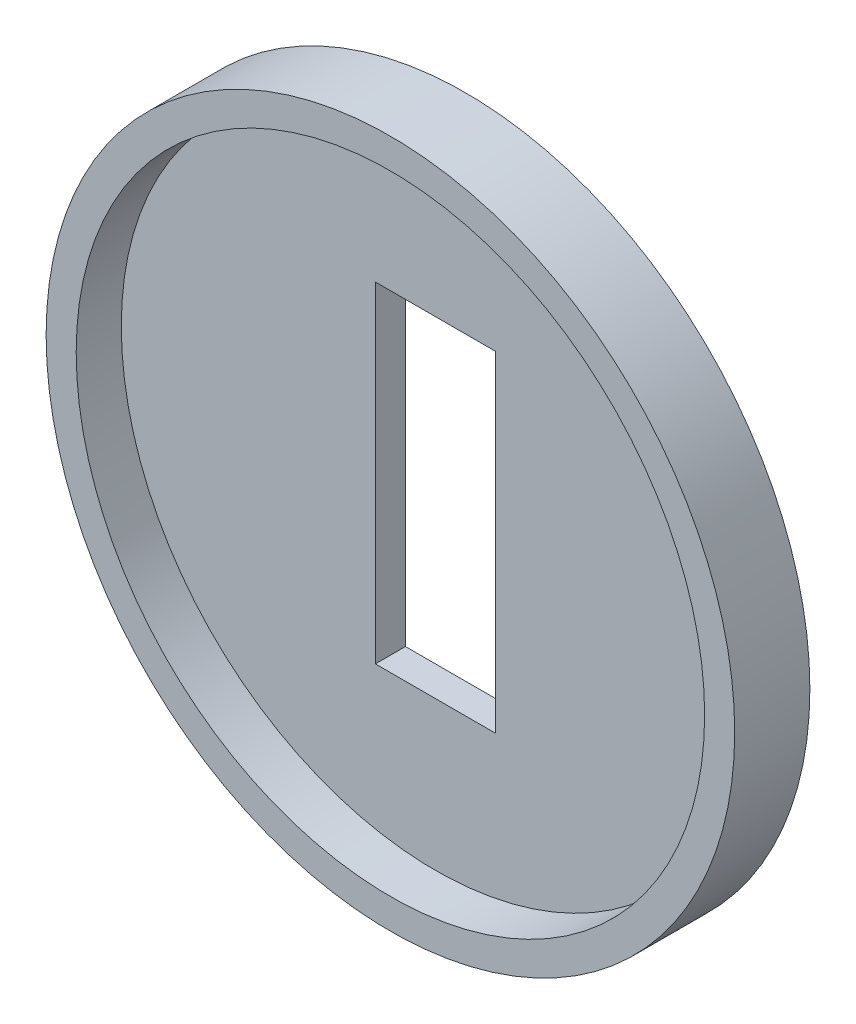
ISO-10303-21;
HEADER;
FILE_DESCRIPTION(('STEP AP214'),'2;1');
FILE_NAME('part.step','',(''),(''),'','','');
FILE_SCHEMA(('AUTOMOTIVE_DESIGN { 1 0 10303 214 1 1 1 1 }'));
ENDSEC;
DATA;
#1=APPLICATION_CONTEXT('core data for automotive mechanical design processes');
#2=APPLICATION_PROTOCOL_DEFINITION('international standard','automotive_design',2000,#1);
#3=PRODUCT_CONTEXT('',#1,'mechanical');
#4=PRODUCT('Part','Part','',(#3));
#5=PRODUCT_RELATED_PRODUCT_CATEGORY('part','',(#4));
#6=PRODUCT_DEFINITION_FORMATION('','',#4);
#7=PRODUCT_DEFINITION_CONTEXT('part definition',#1,'design');
#8=PRODUCT_DEFINITION('design','',#6,#7);
#9=PRODUCT_DEFINITION_SHAPE('','',#8);
#10=(LENGTH_UNIT() NAMED_UNIT(*) SI_UNIT(.MILLI.,.METRE.));
#11=(NAMED_UNIT(*) PLANE_ANGLE_UNIT() SI_UNIT($,.RADIAN.));
#12=(NAMED_UNIT(*) SI_UNIT($,.STERADIAN.) SOLID_ANGLE_UNIT());
#13=UNCERTAINTY_MEASURE_WITH_UNIT(LENGTH_MEASURE(1.E-05),#10,'distance_accuracy_value','');
#14=(GEOMETRIC_REPRESENTATION_CONTEXT(3) GLOBAL_UNCERTAINTY_ASSIGNED_CONTEXT((#13)) GLOBAL_UNIT_ASSIGNED_CONTEXT((#10,
#11,#12)) REPRESENTATION_CONTEXT('',''));
#15=CARTESIAN_POINT('',(0.,0.,0.));
#16=DIRECTION('',(0.,0.,1.));
#17=DIRECTION('',(1.,0.,0.));
#18=AXIS2_PLACEMENT_3D('',#15,#16,#17);
#19=CARTESIAN_POINT('',(0.,0.,0.));
#20=DIRECTION('',(0.,0.,-1.));
#21=DIRECTION('',(-1.,0.,0.));
#22=AXIS2_PLACEMENT_3D('',#19,#20,#21);
#23=PLANE('',#22);
#24=CARTESIAN_POINT('',(0.,0.,0.));
#25=DIRECTION('',(0.,0.,1.));
#26=DIRECTION('',(1.,0.,0.));
#27=AXIS2_PLACEMENT_3D('',#24,#25,#26);
#28=CIRCLE('',#27,22.902);
#29=CARTESIAN_POINT('',(22.902,0.,0.));
#30=VERTEX_POINT('',#29);
#31=EDGE_CURVE('E112',#30,#30,#28,.T.);
#32=ORIENTED_EDGE('',*,*,#31,.F.);
#33=EDGE_LOOP('',(#32));
#34=FACE_BOUND('',#33,.T.);
#35=DIRECTION('',(1.,0.,0.));
#36=VECTOR('',#35,1.);
#37=CARTESIAN_POINT('',(0.,11.,0.));
#38=LINE('',#37,#36);
#39=CARTESIAN_POINT('',(-4.,11.,0.));
#40=VERTEX_POINT('',#39);
#41=CARTESIAN_POINT('',(4.,11.,0.));
#42=VERTEX_POINT('',#41);
#43=EDGE_CURVE('E89',#40,#42,#38,.T.);
#44=ORIENTED_EDGE('',*,*,#43,.F.);
#45=DIRECTION('',(0.,-1.,0.));
#46=VECTOR('',#45,1.);
#47=CARTESIAN_POINT('',(-4.,0.,0.));
#48=LINE('',#47,#46);
#49=CARTESIAN_POINT('',(-4.,-11.,0.));
#50=VERTEX_POINT('',#49);
#51=EDGE_CURVE('E51',#40,#50,#48,.T.);
#52=ORIENTED_EDGE('',*,*,#51,.T.);
#53=DIRECTION('',(1.,0.,0.));
#54=VECTOR('',#53,1.);
#55=CARTESIAN_POINT('',(0.,-11.,0.));
#56=LINE('',#55,#54);
#57=CARTESIAN_POINT('',(4.,-11.,0.));
#58=VERTEX_POINT('',#57);
#59=EDGE_CURVE('E94',#50,#58,#56,.T.);
#60=ORIENTED_EDGE('',*,*,#59,.T.);
#61=DIRECTION('',(0.,-1.,0.));
#62=VECTOR('',#61,1.);
#63=CARTESIAN_POINT('',(4.,0.,0.));
#64=LINE('',#63,#62);
#65=EDGE_CURVE('E80',#42,#58,#64,.T.);
#66=ORIENTED_EDGE('',*,*,#65,.F.);
#67=EDGE_LOOP('',(#44,#52,#60,#66));
#68=FACE_BOUND('',#67,.T.);
#69=ADVANCED_FACE('F37',(#34,#68),#23,.T.);
#70=CARTESIAN_POINT('',(20.902,0.,2.));
#71=DIRECTION('',(0.,0.,1.));
#72=DIRECTION('',(1.,0.,0.));
#73=AXIS2_PLACEMENT_3D('',#70,#71,#72);
#74=PLANE('',#73);
#75=CARTESIAN_POINT('',(0.,0.,2.));
#76=DIRECTION('',(0.,0.,1.));
#77=DIRECTION('',(1.,0.,0.));
#78=AXIS2_PLACEMENT_3D('',#75,#76,#77);
#79=CIRCLE('',#78,20.902);
#80=CARTESIAN_POINT('',(20.902,0.,2.));
#81=VERTEX_POINT('',#80);
#82=EDGE_CURVE('E101',#81,#81,#79,.T.);
#83=ORIENTED_EDGE('',*,*,#82,.T.);
#84=EDGE_LOOP('',(#83));
#85=FACE_BOUND('',#84,.T.);
#86=DIRECTION('',(-1.,0.,0.));
#87=VECTOR('',#86,1.);
#88=CARTESIAN_POINT('',(20.902,-11.,2.));
#89=LINE('',#88,#87);
#90=CARTESIAN_POINT('',(4.,-11.,2.));
#91=VERTEX_POINT('',#90);
#92=CARTESIAN_POINT('',(-4.,-11.,2.));
#93=VERTEX_POINT('',#92);
#94=EDGE_CURVE('E44',#91,#93,#89,.T.);
#95=ORIENTED_EDGE('',*,*,#94,.T.);
#96=DIRECTION('',(0.,1.,0.));
#97=VECTOR('',#96,1.);
#98=CARTESIAN_POINT('',(-4.,0.,2.));
#99=LINE('',#98,#97);
#100=CARTESIAN_POINT('',(-4.,11.,2.));
#101=VERTEX_POINT('',#100);
#102=EDGE_CURVE('E11',#93,#101,#99,.T.);
#103=ORIENTED_EDGE('',*,*,#102,.T.);
#104=DIRECTION('',(-1.,0.,0.));
#105=VECTOR('',#104,1.);
#106=CARTESIAN_POINT('',(20.902,11.,2.));
#107=LINE('',#106,#105);
#108=CARTESIAN_POINT('',(4.,11.,2.));
#109=VERTEX_POINT('',#108);
#110=EDGE_CURVE('E115',#109,#101,#107,.T.);
#111=ORIENTED_EDGE('',*,*,#110,.F.);
#112=DIRECTION('',(0.,1.,0.));
#113=VECTOR('',#112,1.);
#114=CARTESIAN_POINT('',(4.,0.,2.));
#115=LINE('',#114,#113);
#116=EDGE_CURVE('E83',#91,#109,#115,.T.);
#117=ORIENTED_EDGE('',*,*,#116,.F.);
#118=EDGE_LOOP('',(#95,#103,#111,#117));
#119=FACE_BOUND('',#118,.T.);
#120=ADVANCED_FACE('F119',(#85,#119),#74,.T.);
#121=CARTESIAN_POINT('',(0.,0.,2.));
#122=DIRECTION('',(0.,0.,1.));
#123=DIRECTION('',(1.,0.,0.));
#124=AXIS2_PLACEMENT_3D('',#121,#122,#123);
#125=CYLINDRICAL_SURFACE('',#124,22.902);
#126=ORIENTED_EDGE('',*,*,#31,.T.);
#127=EDGE_LOOP('',(#126));
#128=FACE_BOUND('',#127,.T.);
#129=CARTESIAN_POINT('',(0.,0.,5.));
#130=DIRECTION('',(0.,0.,1.));
#131=DIRECTION('',(1.,0.,0.));
#132=AXIS2_PLACEMENT_3D('',#129,#130,#131);
#133=CIRCLE('',#132,22.902);
#134=CARTESIAN_POINT('',(22.902,0.,5.));
#135=VERTEX_POINT('',#134);
#136=EDGE_CURVE('E109',#135,#135,#133,.T.);
#137=ORIENTED_EDGE('',*,*,#136,.F.);
#138=EDGE_LOOP('',(#137));
#139=FACE_BOUND('',#138,.T.);
#140=ADVANCED_FACE('F142',(#128,#139),#125,.T.);
#141=CARTESIAN_POINT('',(22.902,0.,5.));
#142=DIRECTION('',(0.,0.,1.));
#143=DIRECTION('',(1.,0.,0.));
#144=AXIS2_PLACEMENT_3D('',#141,#142,#143);
#145=PLANE('',#144);
#146=ORIENTED_EDGE('',*,*,#136,.T.);
#147=EDGE_LOOP('',(#146));
#148=FACE_BOUND('',#147,.T.);
#149=CARTESIAN_POINT('',(0.,0.,5.));
#150=DIRECTION('',(0.,0.,1.));
#151=DIRECTION('',(1.,0.,0.));
#152=AXIS2_PLACEMENT_3D('',#149,#150,#151);
#153=CIRCLE('',#152,20.902);
#154=CARTESIAN_POINT('',(20.902,0.,5.));
#155=VERTEX_POINT('',#154);
#156=EDGE_CURVE('E106',#155,#155,#153,.T.);
#157=ORIENTED_EDGE('',*,*,#156,.F.);
#158=EDGE_LOOP('',(#157));
#159=FACE_BOUND('',#158,.T.);
#160=ADVANCED_FACE('F132',(#148,#159),#145,.T.);
#161=CARTESIAN_POINT('',(0.,0.,2.));
#162=DIRECTION('',(0.,0.,1.));
#163=DIRECTION('',(1.,0.,0.));
#164=AXIS2_PLACEMENT_3D('',#161,#162,#163);
#165=CYLINDRICAL_SURFACE('',#164,20.902);
#166=ORIENTED_EDGE('',*,*,#156,.T.);
#167=EDGE_LOOP('',(#166));
#168=FACE_BOUND('',#167,.T.);
#169=ORIENTED_EDGE('',*,*,#82,.F.);
#170=EDGE_LOOP('',(#169));
#171=FACE_BOUND('',#170,.T.);
#172=ADVANCED_FACE('F125',(#168,#171),#165,.F.);
#173=CARTESIAN_POINT('',(-4.,0.,10.));
#174=DIRECTION('',(1.,0.,0.));
#175=DIRECTION('',(0.,0.,-1.));
#176=AXIS2_PLACEMENT_3D('',#173,#174,#175);
#177=PLANE('',#176);
#178=DIRECTION('',(0.,0.,-1.));
#179=VECTOR('',#178,1.);
#180=CARTESIAN_POINT('',(-4.,-11.,10.));
#181=LINE('',#180,#179);
#182=EDGE_CURVE('E99',#93,#50,#181,.T.);
#183=ORIENTED_EDGE('',*,*,#182,.T.);
#184=ORIENTED_EDGE('',*,*,#51,.F.);
#185=DIRECTION('',(0.,0.,-1.));
#186=VECTOR('',#185,1.);
#187=CARTESIAN_POINT('',(-4.,11.,10.));
#188=LINE('',#187,#186);
#189=EDGE_CURVE('E86',#101,#40,#188,.T.);
#190=ORIENTED_EDGE('',*,*,#189,.F.);
#191=ORIENTED_EDGE('',*,*,#102,.F.);
#192=EDGE_LOOP('',(#183,#184,#190,#191));
#193=FACE_BOUND('',#192,.T.);
#194=ADVANCED_FACE('F123',(#193),#177,.T.);
#195=CARTESIAN_POINT('',(0.,-11.,10.));
#196=DIRECTION('',(0.,1.,0.));
#197=DIRECTION('',(0.,0.,1.));
#198=AXIS2_PLACEMENT_3D('',#195,#196,#197);
#199=PLANE('',#198);
#200=DIRECTION('',(0.,0.,-1.));
#201=VECTOR('',#200,1.);
#202=CARTESIAN_POINT('',(4.,-11.,10.));
#203=LINE('',#202,#201);
#204=EDGE_CURVE('E85',#91,#58,#203,.T.);
#205=ORIENTED_EDGE('',*,*,#204,.T.);
#206=ORIENTED_EDGE('',*,*,#59,.F.);
#207=ORIENTED_EDGE('',*,*,#182,.F.);
#208=ORIENTED_EDGE('',*,*,#94,.F.);
#209=EDGE_LOOP('',(#205,#206,#207,#208));
#210=FACE_BOUND('',#209,.T.);
#211=ADVANCED_FACE('F122',(#210),#199,.T.);
#212=CARTESIAN_POINT('',(4.,0.,10.));
#213=DIRECTION('',(1.,0.,0.));
#214=DIRECTION('',(0.,1.,0.));
#215=AXIS2_PLACEMENT_3D('',#212,#213,#214);
#216=PLANE('',#215);
#217=ORIENTED_EDGE('',*,*,#116,.T.);
#218=DIRECTION('',(0.,0.,-1.));
#219=VECTOR('',#218,1.);
#220=CARTESIAN_POINT('',(4.,11.,10.));
#221=LINE('',#220,#219);
#222=EDGE_CURVE('E59',#109,#42,#221,.T.);
#223=ORIENTED_EDGE('',*,*,#222,.T.);
#224=ORIENTED_EDGE('',*,*,#65,.T.);
#225=ORIENTED_EDGE('',*,*,#204,.F.);
#226=EDGE_LOOP('',(#217,#223,#224,#225));
#227=FACE_BOUND('',#226,.T.);
#228=ADVANCED_FACE('F77',(#227),#216,.F.);
#229=CARTESIAN_POINT('',(0.,11.,10.));
#230=DIRECTION('',(0.,1.,0.));
#231=DIRECTION('',(0.,0.,1.));
#232=AXIS2_PLACEMENT_3D('',#229,#230,#231);
#233=PLANE('',#232);
#234=ORIENTED_EDGE('',*,*,#110,.T.);
#235=ORIENTED_EDGE('',*,*,#189,.T.);
#236=ORIENTED_EDGE('',*,*,#43,.T.);
#237=ORIENTED_EDGE('',*,*,#222,.F.);
#238=EDGE_LOOP('',(#234,#235,#236,#237));
#239=FACE_BOUND('',#238,.T.);
#240=ADVANCED_FACE('F90',(#239),#233,.F.);
#241=CLOSED_SHELL('',(#69,#120,#140,#160,#172,#194,#211,#228,#240));
#242=MANIFOLD_SOLID_BREP('B2',#241);
#243=ADVANCED_BREP_SHAPE_REPRESENTATION('',(#18,#242),#14);
#244=SHAPE_DEFINITION_REPRESENTATION(#9,#243);
ENDSEC;
END-ISO-10303-21;
